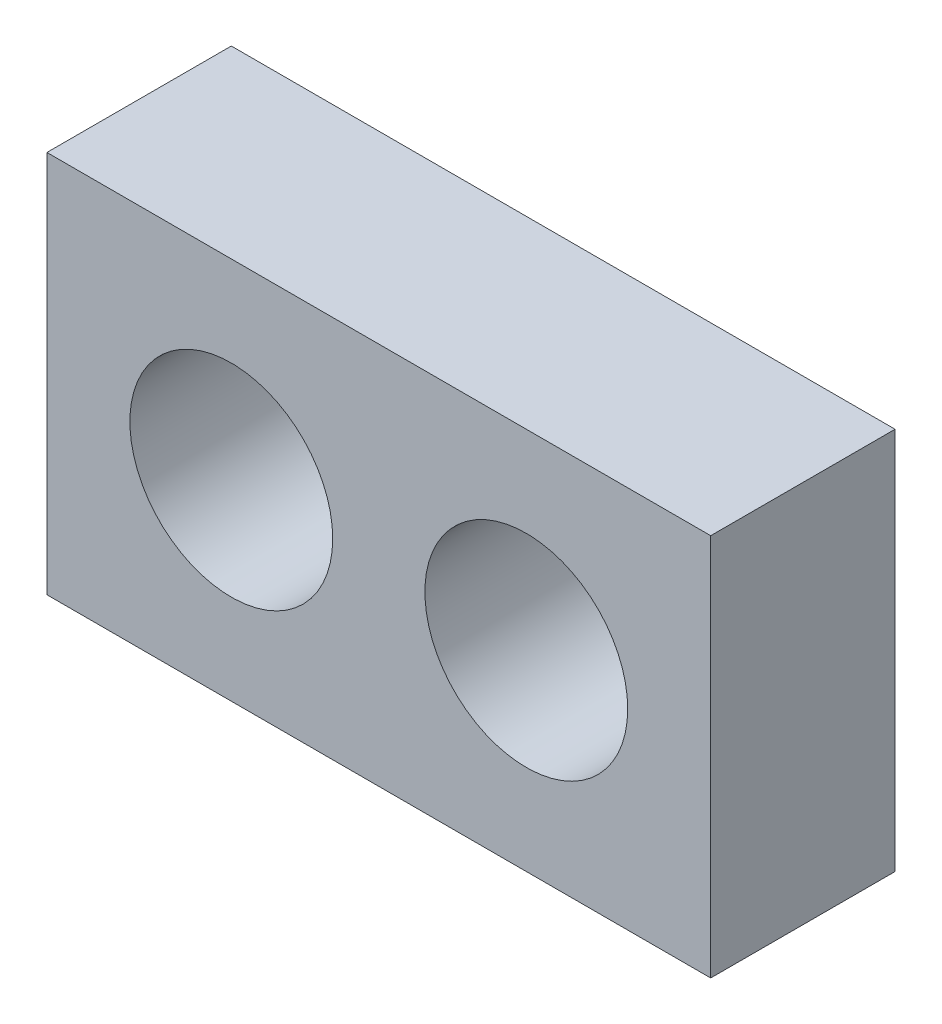
ISO-10303-21;
HEADER;
FILE_DESCRIPTION(('STEP AP214'),'2;1');
FILE_NAME('part.step','',(''),(''),'','','');
FILE_SCHEMA(('AUTOMOTIVE_DESIGN { 1 0 10303 214 1 1 1 1 }'));
ENDSEC;
DATA;
#1=APPLICATION_CONTEXT('core data for automotive mechanical design processes');
#2=APPLICATION_PROTOCOL_DEFINITION('international standard','automotive_design',2000,#1);
#3=PRODUCT_CONTEXT('',#1,'mechanical');
#4=PRODUCT('Part','Part','',(#3));
#5=PRODUCT_RELATED_PRODUCT_CATEGORY('part','',(#4));
#6=PRODUCT_DEFINITION_FORMATION('','',#4);
#7=PRODUCT_DEFINITION_CONTEXT('part definition',#1,'design');
#8=PRODUCT_DEFINITION('design','',#6,#7);
#9=PRODUCT_DEFINITION_SHAPE('','',#8);
#10=(LENGTH_UNIT() NAMED_UNIT(*) SI_UNIT(.MILLI.,.METRE.));
#11=(NAMED_UNIT(*) PLANE_ANGLE_UNIT() SI_UNIT($,.RADIAN.));
#12=(NAMED_UNIT(*) SI_UNIT($,.STERADIAN.) SOLID_ANGLE_UNIT());
#13=UNCERTAINTY_MEASURE_WITH_UNIT(LENGTH_MEASURE(1.E-05),#10,'distance_accuracy_value','');
#14=(GEOMETRIC_REPRESENTATION_CONTEXT(3) GLOBAL_UNCERTAINTY_ASSIGNED_CONTEXT((#13)) GLOBAL_UNIT_ASSIGNED_CONTEXT((#10,
#11,#12)) REPRESENTATION_CONTEXT('',''));
#15=CARTESIAN_POINT('',(0.,0.,0.));
#16=DIRECTION('',(0.,0.,1.));
#17=DIRECTION('',(1.,0.,0.));
#18=AXIS2_PLACEMENT_3D('',#15,#16,#17);
#19=CARTESIAN_POINT('',(0.,0.,5.));
#20=DIRECTION('',(0.,0.,1.));
#21=DIRECTION('',(1.,0.,0.));
#22=AXIS2_PLACEMENT_3D('',#19,#20,#21);
#23=PLANE('',#22);
#24=CARTESIAN_POINT('',(-9.89165516563497,5.19381978528958,5.));
#25=DIRECTION('',(0.,0.,1.));
#26=DIRECTION('',(1.,0.,0.));
#27=AXIS2_PLACEMENT_3D('',#24,#25,#26);
#28=CIRCLE('',#27,2.75);
#29=CARTESIAN_POINT('',(-7.14165516563497,5.19381978528958,5.));
#30=VERTEX_POINT('',#29);
#31=EDGE_CURVE('E118',#30,#30,#28,.T.);
#32=ORIENTED_EDGE('',*,*,#31,.F.);
#33=EDGE_LOOP('',(#32));
#34=FACE_BOUND('',#33,.T.);
#35=DIRECTION('',(0.,-1.,0.));
#36=VECTOR('',#35,1.);
#37=CARTESIAN_POINT('',(-14.891655165635,10.3876395705792,5.));
#38=LINE('',#37,#36);
#39=CARTESIAN_POINT('',(-14.891655165635,10.3876395705792,5.));
#40=VERTEX_POINT('',#39);
#41=CARTESIAN_POINT('',(-14.891655165635,0.,5.));
#42=VERTEX_POINT('',#41);
#43=EDGE_CURVE('E98',#40,#42,#38,.T.);
#44=ORIENTED_EDGE('',*,*,#43,.T.);
#45=DIRECTION('',(1.,0.,0.));
#46=VECTOR('',#45,1.);
#47=CARTESIAN_POINT('',(-14.891655165635,0.,5.));
#48=LINE('',#47,#46);
#49=CARTESIAN_POINT('',(3.10834483436503,0.,5.));
#50=VERTEX_POINT('',#49);
#51=EDGE_CURVE('E93',#42,#50,#48,.T.);
#52=ORIENTED_EDGE('',*,*,#51,.T.);
#53=DIRECTION('',(0.,1.,0.));
#54=VECTOR('',#53,1.);
#55=CARTESIAN_POINT('',(3.10834483436503,10.3876395705792,5.));
#56=LINE('',#55,#54);
#57=CARTESIAN_POINT('',(3.10834483436503,10.3876395705792,5.));
#58=VERTEX_POINT('',#57);
#59=EDGE_CURVE('E96',#50,#58,#56,.T.);
#60=ORIENTED_EDGE('',*,*,#59,.T.);
#61=DIRECTION('',(-1.,0.,0.));
#62=VECTOR('',#61,1.);
#63=CARTESIAN_POINT('',(-14.891655165635,10.3876395705792,5.));
#64=LINE('',#63,#62);
#65=EDGE_CURVE('E63',#58,#40,#64,.T.);
#66=ORIENTED_EDGE('',*,*,#65,.T.);
#67=EDGE_LOOP('',(#44,#52,#60,#66));
#68=FACE_BOUND('',#67,.T.);
#69=CARTESIAN_POINT('',(-1.89165516563497,5.19381978528958,5.));
#70=DIRECTION('',(0.,0.,1.));
#71=DIRECTION('',(1.,0.,0.));
#72=AXIS2_PLACEMENT_3D('',#69,#70,#71);
#73=CIRCLE('',#72,2.75);
#74=CARTESIAN_POINT('',(0.858344834365032,5.19381978528958,5.));
#75=VERTEX_POINT('',#74);
#76=EDGE_CURVE('E140',#75,#75,#73,.T.);
#77=ORIENTED_EDGE('',*,*,#76,.F.);
#78=EDGE_LOOP('',(#77));
#79=FACE_BOUND('',#78,.T.);
#80=ADVANCED_FACE('F45',(#34,#68,#79),#23,.T.);
#81=CARTESIAN_POINT('',(0.,0.,0.));
#82=DIRECTION('',(0.,0.,1.));
#83=DIRECTION('',(1.,0.,0.));
#84=AXIS2_PLACEMENT_3D('',#81,#82,#83);
#85=PLANE('',#84);
#86=DIRECTION('',(0.,-1.,0.));
#87=VECTOR('',#86,1.);
#88=CARTESIAN_POINT('',(-14.891655165635,10.3876395705792,0.));
#89=LINE('',#88,#87);
#90=CARTESIAN_POINT('',(-14.891655165635,10.3876395705792,0.));
#91=VERTEX_POINT('',#90);
#92=CARTESIAN_POINT('',(-14.891655165635,0.,0.));
#93=VERTEX_POINT('',#92);
#94=EDGE_CURVE('E114',#91,#93,#89,.T.);
#95=ORIENTED_EDGE('',*,*,#94,.F.);
#96=DIRECTION('',(-1.,0.,0.));
#97=VECTOR('',#96,1.);
#98=CARTESIAN_POINT('',(-14.891655165635,10.3876395705792,0.));
#99=LINE('',#98,#97);
#100=CARTESIAN_POINT('',(3.10834483436503,10.3876395705792,0.));
#101=VERTEX_POINT('',#100);
#102=EDGE_CURVE('E86',#101,#91,#99,.T.);
#103=ORIENTED_EDGE('',*,*,#102,.F.);
#104=DIRECTION('',(0.,1.,0.));
#105=VECTOR('',#104,1.);
#106=CARTESIAN_POINT('',(3.10834483436503,10.3876395705792,0.));
#107=LINE('',#106,#105);
#108=CARTESIAN_POINT('',(3.10834483436503,0.,0.));
#109=VERTEX_POINT('',#108);
#110=EDGE_CURVE('E80',#109,#101,#107,.T.);
#111=ORIENTED_EDGE('',*,*,#110,.F.);
#112=DIRECTION('',(1.,0.,0.));
#113=VECTOR('',#112,1.);
#114=CARTESIAN_POINT('',(-14.891655165635,0.,0.));
#115=LINE('',#114,#113);
#116=EDGE_CURVE('E103',#93,#109,#115,.T.);
#117=ORIENTED_EDGE('',*,*,#116,.F.);
#118=EDGE_LOOP('',(#95,#103,#111,#117));
#119=FACE_BOUND('',#118,.T.);
#120=CARTESIAN_POINT('',(-9.89165516563497,5.19381978528958,0.));
#121=DIRECTION('',(0.,0.,1.));
#122=DIRECTION('',(1.,0.,0.));
#123=AXIS2_PLACEMENT_3D('',#120,#121,#122);
#124=CIRCLE('',#123,2.75);
#125=CARTESIAN_POINT('',(-7.14165516563497,5.19381978528958,0.));
#126=VERTEX_POINT('',#125);
#127=EDGE_CURVE('E136',#126,#126,#124,.T.);
#128=ORIENTED_EDGE('',*,*,#127,.T.);
#129=EDGE_LOOP('',(#128));
#130=FACE_BOUND('',#129,.T.);
#131=CARTESIAN_POINT('',(-1.89165516563497,5.19381978528958,0.));
#132=DIRECTION('',(0.,0.,1.));
#133=DIRECTION('',(1.,0.,0.));
#134=AXIS2_PLACEMENT_3D('',#131,#132,#133);
#135=CIRCLE('',#134,2.75);
#136=CARTESIAN_POINT('',(0.858344834365032,5.19381978528958,0.));
#137=VERTEX_POINT('',#136);
#138=EDGE_CURVE('E144',#137,#137,#135,.T.);
#139=ORIENTED_EDGE('',*,*,#138,.T.);
#140=EDGE_LOOP('',(#139));
#141=FACE_BOUND('',#140,.T.);
#142=ADVANCED_FACE('F131',(#119,#130,#141),#85,.F.);
#143=CARTESIAN_POINT('',(-14.891655165635,10.3876395705792,5.));
#144=DIRECTION('',(1.,0.,0.));
#145=DIRECTION('',(0.,0.,-1.));
#146=AXIS2_PLACEMENT_3D('',#143,#144,#145);
#147=PLANE('',#146);
#148=ORIENTED_EDGE('',*,*,#94,.T.);
#149=DIRECTION('',(0.,0.,-1.));
#150=VECTOR('',#149,1.);
#151=CARTESIAN_POINT('',(-14.891655165635,0.,5.));
#152=LINE('',#151,#150);
#153=EDGE_CURVE('E11',#42,#93,#152,.T.);
#154=ORIENTED_EDGE('',*,*,#153,.F.);
#155=ORIENTED_EDGE('',*,*,#43,.F.);
#156=DIRECTION('',(0.,0.,-1.));
#157=VECTOR('',#156,1.);
#158=CARTESIAN_POINT('',(-14.891655165635,10.3876395705792,5.));
#159=LINE('',#158,#157);
#160=EDGE_CURVE('E110',#40,#91,#159,.T.);
#161=ORIENTED_EDGE('',*,*,#160,.T.);
#162=EDGE_LOOP('',(#148,#154,#155,#161));
#163=FACE_BOUND('',#162,.T.);
#164=ADVANCED_FACE('F47',(#163),#147,.F.);
#165=CARTESIAN_POINT('',(-14.891655165635,0.,5.));
#166=DIRECTION('',(0.,1.,0.));
#167=DIRECTION('',(-1.,0.,0.));
#168=AXIS2_PLACEMENT_3D('',#165,#166,#167);
#169=PLANE('',#168);
#170=ORIENTED_EDGE('',*,*,#116,.T.);
#171=DIRECTION('',(0.,0.,-1.));
#172=VECTOR('',#171,1.);
#173=CARTESIAN_POINT('',(3.10834483436503,0.,5.));
#174=LINE('',#173,#172);
#175=EDGE_CURVE('E55',#50,#109,#174,.T.);
#176=ORIENTED_EDGE('',*,*,#175,.F.);
#177=ORIENTED_EDGE('',*,*,#51,.F.);
#178=ORIENTED_EDGE('',*,*,#153,.T.);
#179=EDGE_LOOP('',(#170,#176,#177,#178));
#180=FACE_BOUND('',#179,.T.);
#181=ADVANCED_FACE('F102',(#180),#169,.F.);
#182=CARTESIAN_POINT('',(3.10834483436503,10.3876395705792,5.));
#183=DIRECTION('',(-1.,0.,0.));
#184=DIRECTION('',(0.,0.,1.));
#185=AXIS2_PLACEMENT_3D('',#182,#183,#184);
#186=PLANE('',#185);
#187=ORIENTED_EDGE('',*,*,#110,.T.);
#188=DIRECTION('',(0.,0.,-1.));
#189=VECTOR('',#188,1.);
#190=CARTESIAN_POINT('',(3.10834483436503,10.3876395705792,5.));
#191=LINE('',#190,#189);
#192=EDGE_CURVE('E105',#58,#101,#191,.T.);
#193=ORIENTED_EDGE('',*,*,#192,.F.);
#194=ORIENTED_EDGE('',*,*,#59,.F.);
#195=ORIENTED_EDGE('',*,*,#175,.T.);
#196=EDGE_LOOP('',(#187,#193,#194,#195));
#197=FACE_BOUND('',#196,.T.);
#198=ADVANCED_FACE('F106',(#197),#186,.F.);
#199=CARTESIAN_POINT('',(-14.891655165635,10.3876395705792,5.));
#200=DIRECTION('',(0.,-1.,0.));
#201=DIRECTION('',(0.,0.,-1.));
#202=AXIS2_PLACEMENT_3D('',#199,#200,#201);
#203=PLANE('',#202);
#204=ORIENTED_EDGE('',*,*,#102,.T.);
#205=ORIENTED_EDGE('',*,*,#160,.F.);
#206=ORIENTED_EDGE('',*,*,#65,.F.);
#207=ORIENTED_EDGE('',*,*,#192,.T.);
#208=EDGE_LOOP('',(#204,#205,#206,#207));
#209=FACE_BOUND('',#208,.T.);
#210=ADVANCED_FACE('F128',(#209),#203,.F.);
#211=CARTESIAN_POINT('',(-9.89165516563497,5.19381978528958,5.));
#212=DIRECTION('',(0.,0.,-1.));
#213=DIRECTION('',(-1.,0.,0.));
#214=AXIS2_PLACEMENT_3D('',#211,#212,#213);
#215=CYLINDRICAL_SURFACE('',#214,2.75);
#216=ORIENTED_EDGE('',*,*,#31,.T.);
#217=EDGE_LOOP('',(#216));
#218=FACE_BOUND('',#217,.T.);
#219=ORIENTED_EDGE('',*,*,#127,.F.);
#220=EDGE_LOOP('',(#219));
#221=FACE_BOUND('',#220,.T.);
#222=ADVANCED_FACE('F163',(#218,#221),#215,.F.);
#223=CARTESIAN_POINT('',(-1.89165516563497,5.19381978528958,5.));
#224=DIRECTION('',(0.,0.,-1.));
#225=DIRECTION('',(-1.,0.,0.));
#226=AXIS2_PLACEMENT_3D('',#223,#224,#225);
#227=CYLINDRICAL_SURFACE('',#226,2.75);
#228=ORIENTED_EDGE('',*,*,#76,.T.);
#229=EDGE_LOOP('',(#228));
#230=FACE_BOUND('',#229,.T.);
#231=ORIENTED_EDGE('',*,*,#138,.F.);
#232=EDGE_LOOP('',(#231));
#233=FACE_BOUND('',#232,.T.);
#234=ADVANCED_FACE('F152',(#230,#233),#227,.F.);
#235=CLOSED_SHELL('',(#80,#142,#164,#181,#198,#210,#222,#234));
#236=MANIFOLD_SOLID_BREP('B2',#235);
#237=ADVANCED_BREP_SHAPE_REPRESENTATION('',(#18,#236),#14);
#238=SHAPE_DEFINITION_REPRESENTATION(#9,#237);
ENDSEC;
END-ISO-10303-21;
